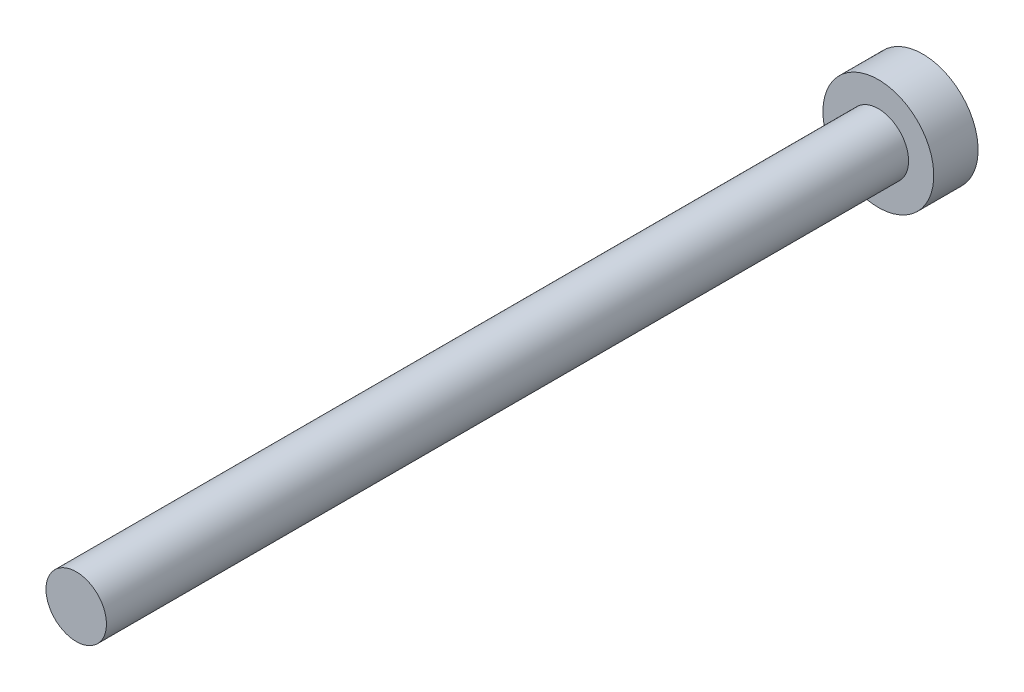
ISO-10303-21;
HEADER;
FILE_DESCRIPTION(('STEP AP214'),'2;1');
FILE_NAME('part.step','',(''),(''),'','','');
FILE_SCHEMA(('AUTOMOTIVE_DESIGN { 1 0 10303 214 1 1 1 1 }'));
ENDSEC;
DATA;
#1=APPLICATION_CONTEXT('core data for automotive mechanical design processes');
#2=APPLICATION_PROTOCOL_DEFINITION('international standard','automotive_design',2000,#1);
#3=PRODUCT_CONTEXT('',#1,'mechanical');
#4=PRODUCT('Part','Part','',(#3));
#5=PRODUCT_RELATED_PRODUCT_CATEGORY('part','',(#4));
#6=PRODUCT_DEFINITION_FORMATION('','',#4);
#7=PRODUCT_DEFINITION_CONTEXT('part definition',#1,'design');
#8=PRODUCT_DEFINITION('design','',#6,#7);
#9=PRODUCT_DEFINITION_SHAPE('','',#8);
#10=(LENGTH_UNIT() NAMED_UNIT(*) SI_UNIT(.MILLI.,.METRE.));
#11=(NAMED_UNIT(*) PLANE_ANGLE_UNIT() SI_UNIT($,.RADIAN.));
#12=(NAMED_UNIT(*) SI_UNIT($,.STERADIAN.) SOLID_ANGLE_UNIT());
#13=UNCERTAINTY_MEASURE_WITH_UNIT(LENGTH_MEASURE(1.E-05),#10,'distance_accuracy_value','');
#14=(GEOMETRIC_REPRESENTATION_CONTEXT(3) GLOBAL_UNCERTAINTY_ASSIGNED_CONTEXT((#13)) GLOBAL_UNIT_ASSIGNED_CONTEXT((#10,
#11,#12)) REPRESENTATION_CONTEXT('',''));
#15=CARTESIAN_POINT('',(0.,0.,0.));
#16=DIRECTION('',(0.,0.,1.));
#17=DIRECTION('',(1.,0.,0.));
#18=AXIS2_PLACEMENT_3D('',#15,#16,#17);
#19=CARTESIAN_POINT('',(0.,0.,94.5));
#20=DIRECTION('',(0.,0.,-1.));
#21=DIRECTION('',(-1.,0.,0.));
#22=AXIS2_PLACEMENT_3D('',#19,#20,#21);
#23=CYLINDRICAL_SURFACE('',#22,3.375);
#24=CARTESIAN_POINT('',(0.,0.,94.5));
#25=DIRECTION('',(0.,0.,1.));
#26=DIRECTION('',(1.,0.,0.));
#27=AXIS2_PLACEMENT_3D('',#24,#25,#26);
#28=CIRCLE('',#27,3.375);
#29=CARTESIAN_POINT('',(-3.375,0.,94.5));
#30=VERTEX_POINT('',#29);
#31=EDGE_CURVE('E53',#30,#30,#28,.T.);
#32=CARTESIAN_POINT('',(0.,0.,4.95));
#33=DIRECTION('',(0.,0.,-1.));
#34=DIRECTION('',(-1.,0.,0.));
#35=AXIS2_PLACEMENT_3D('',#32,#33,#34);
#36=CIRCLE('',#35,3.375);
#37=CARTESIAN_POINT('',(-3.375,0.,4.95));
#38=VERTEX_POINT('',#37);
#39=EDGE_CURVE('E10',#38,#38,#36,.T.);
#40=CARTESIAN_POINT('',(-3.375,0.,94.5));
#41=CARTESIAN_POINT('',(-3.375,0.,93.5671875));
#42=CARTESIAN_POINT('',(-3.375,0.,92.634375));
#43=CARTESIAN_POINT('',(-3.375,0.,90.76875));
#44=CARTESIAN_POINT('',(-3.375,0.,89.8359375));
#45=CARTESIAN_POINT('',(-3.375,0.,87.9703125));
#46=CARTESIAN_POINT('',(-3.375,0.,87.0375));
#47=CARTESIAN_POINT('',(-3.375,0.,85.171875));
#48=CARTESIAN_POINT('',(-3.375,0.,84.2390625));
#49=CARTESIAN_POINT('',(-3.375,0.,82.3734375));
#50=CARTESIAN_POINT('',(-3.375,0.,81.440625));
#51=CARTESIAN_POINT('',(-3.375,0.,79.575));
#52=CARTESIAN_POINT('',(-3.375,0.,78.6421875));
#53=CARTESIAN_POINT('',(-3.375,0.,76.7765625));
#54=CARTESIAN_POINT('',(-3.375,0.,75.84375));
#55=CARTESIAN_POINT('',(-3.375,0.,73.978125));
#56=CARTESIAN_POINT('',(-3.375,0.,73.0453125));
#57=CARTESIAN_POINT('',(-3.375,0.,71.1796875));
#58=CARTESIAN_POINT('',(-3.375,0.,70.246875));
#59=CARTESIAN_POINT('',(-3.375,0.,68.38125));
#60=CARTESIAN_POINT('',(-3.375,0.,67.4484375));
#61=CARTESIAN_POINT('',(-3.375,0.,65.5828125));
#62=CARTESIAN_POINT('',(-3.375,0.,64.65));
#63=CARTESIAN_POINT('',(-3.375,0.,62.784375));
#64=CARTESIAN_POINT('',(-3.375,0.,61.8515625));
#65=CARTESIAN_POINT('',(-3.375,0.,59.9859375));
#66=CARTESIAN_POINT('',(-3.375,0.,59.053125));
#67=CARTESIAN_POINT('',(-3.375,0.,57.1875));
#68=CARTESIAN_POINT('',(-3.375,0.,56.2546875));
#69=CARTESIAN_POINT('',(-3.375,0.,54.3890625));
#70=CARTESIAN_POINT('',(-3.375,0.,53.45625));
#71=CARTESIAN_POINT('',(-3.375,0.,51.590625));
#72=CARTESIAN_POINT('',(-3.375,0.,50.6578125));
#73=CARTESIAN_POINT('',(-3.375,0.,48.7921875));
#74=CARTESIAN_POINT('',(-3.375,0.,47.859375));
#75=CARTESIAN_POINT('',(-3.375,0.,45.99375));
#76=CARTESIAN_POINT('',(-3.375,0.,45.0609375));
#77=CARTESIAN_POINT('',(-3.375,0.,43.1953125));
#78=CARTESIAN_POINT('',(-3.375,0.,42.2625));
#79=CARTESIAN_POINT('',(-3.375,0.,40.396875));
#80=CARTESIAN_POINT('',(-3.375,0.,39.4640625));
#81=CARTESIAN_POINT('',(-3.375,0.,37.5984375));
#82=CARTESIAN_POINT('',(-3.375,0.,36.665625));
#83=CARTESIAN_POINT('',(-3.375,0.,34.8));
#84=CARTESIAN_POINT('',(-3.375,0.,33.8671875));
#85=CARTESIAN_POINT('',(-3.375,0.,32.0015625));
#86=CARTESIAN_POINT('',(-3.375,0.,31.06875));
#87=CARTESIAN_POINT('',(-3.375,0.,29.203125));
#88=CARTESIAN_POINT('',(-3.375,0.,28.2703125));
#89=CARTESIAN_POINT('',(-3.375,0.,26.4046875));
#90=CARTESIAN_POINT('',(-3.375,0.,25.471875));
#91=CARTESIAN_POINT('',(-3.375,0.,23.60625));
#92=CARTESIAN_POINT('',(-3.375,0.,22.6734375));
#93=CARTESIAN_POINT('',(-3.375,0.,20.8078125));
#94=CARTESIAN_POINT('',(-3.375,0.,19.875));
#95=CARTESIAN_POINT('',(-3.375,0.,18.009375));
#96=CARTESIAN_POINT('',(-3.375,0.,17.0765625));
#97=CARTESIAN_POINT('',(-3.375,0.,15.2109375));
#98=CARTESIAN_POINT('',(-3.375,0.,14.278125));
#99=CARTESIAN_POINT('',(-3.375,0.,12.4125));
#100=CARTESIAN_POINT('',(-3.375,0.,11.4796875));
#101=CARTESIAN_POINT('',(-3.375,0.,9.6140625));
#102=CARTESIAN_POINT('',(-3.375,0.,8.68125));
#103=CARTESIAN_POINT('',(-3.375,0.,6.815625));
#104=CARTESIAN_POINT('',(-3.375,0.,5.8828125));
#105=CARTESIAN_POINT('',(-3.375,0.,4.95));
#106=B_SPLINE_CURVE_WITH_KNOTS('',3,(#40,#41,#42,#43,#44,#45,#46,#47,#48,#49,#50,#51,#52,#53,
#54,#55,#56,#57,#58,#59,#60,#61,#62,#63,#64,#65,#66,#67,#68,#69,#70,#71,#72,#73,#74,#75,#76,#77,
#78,#79,#80,#81,#82,#83,#84,#85,#86,#87,#88,#89,#90,#91,#92,#93,#94,#95,#96,#97,#98,#99,#100,
#101,#102,#103,#104,#105),.UNSPECIFIED.,.F.,.F.,(4,2,2,2,2,2,2,2,2,2,2,2,2,2,2,2,2,2,2,2,2,2,2,
2,2,2,2,2,2,2,2,2,4),(0.,2.79843749999999,5.59687499999999,8.39531249999999,11.19375,13.9921875,
16.790625,19.5890625,22.3875,25.1859375,27.984375,30.7828125,33.58125,36.3796875,39.178125,
41.9765625,44.775,47.5734375,50.371875,53.1703125,55.96875,58.7671875,61.565625,64.3640625,
67.1625,69.9609375,72.759375,75.5578125,78.35625,81.1546875,83.953125,86.7515625,89.55),.UNSPECIFIED.);
#107=EDGE_CURVE('BSEAM46',#30,#38,#106,.T.);
#108=ORIENTED_EDGE('',*,*,#31,.F.);
#109=ORIENTED_EDGE('',*,*,#39,.F.);
#110=ORIENTED_EDGE('',*,*,#107,.T.);
#111=ORIENTED_EDGE('',*,*,#107,.F.);
#112=EDGE_LOOP('',(#108,#110,#109,#111));
#113=FACE_BOUND('',#112,.T.);
#114=ADVANCED_FACE('F46',(#113),#23,.T.);
#115=CARTESIAN_POINT('',(0.,0.,94.5));
#116=DIRECTION('',(0.,0.,1.));
#117=DIRECTION('',(1.,0.,0.));
#118=AXIS2_PLACEMENT_3D('',#115,#116,#117);
#119=PLANE('',#118);
#120=ORIENTED_EDGE('',*,*,#31,.T.);
#121=EDGE_LOOP('',(#120));
#122=FACE_BOUND('',#121,.T.);
#123=ADVANCED_FACE('F75',(#122),#119,.T.);
#124=CARTESIAN_POINT('',(0.,0.,4.95));
#125=DIRECTION('',(0.,0.,-1.));
#126=DIRECTION('',(-1.,0.,0.));
#127=AXIS2_PLACEMENT_3D('',#124,#125,#126);
#128=CYLINDRICAL_SURFACE('',#127,6.1875);
#129=CARTESIAN_POINT('',(0.,0.,4.95));
#130=DIRECTION('',(0.,0.,-1.));
#131=DIRECTION('',(-1.,0.,0.));
#132=AXIS2_PLACEMENT_3D('',#129,#130,#131);
#133=CIRCLE('',#132,6.1875);
#134=CARTESIAN_POINT('',(-6.1875,0.,4.95));
#135=VERTEX_POINT('',#134);
#136=EDGE_CURVE('E58',#135,#135,#133,.T.);
#137=ORIENTED_EDGE('',*,*,#136,.T.);
#138=EDGE_LOOP('',(#137));
#139=FACE_BOUND('',#138,.T.);
#140=CARTESIAN_POINT('',(0.,0.,0.));
#141=DIRECTION('',(0.,0.,-1.));
#142=DIRECTION('',(-1.,0.,0.));
#143=AXIS2_PLACEMENT_3D('',#140,#141,#142);
#144=CIRCLE('',#143,6.1875);
#145=CARTESIAN_POINT('',(-6.1875,0.,0.));
#146=VERTEX_POINT('',#145);
#147=EDGE_CURVE('E63',#146,#146,#144,.T.);
#148=ORIENTED_EDGE('',*,*,#147,.F.);
#149=EDGE_LOOP('',(#148));
#150=FACE_BOUND('',#149,.T.);
#151=ADVANCED_FACE('F72',(#139,#150),#128,.T.);
#152=CARTESIAN_POINT('',(0.,0.,4.95));
#153=DIRECTION('',(0.,0.,-1.));
#154=DIRECTION('',(-1.,0.,0.));
#155=AXIS2_PLACEMENT_3D('',#152,#153,#154);
#156=PLANE('',#155);
#157=ORIENTED_EDGE('',*,*,#39,.T.);
#158=EDGE_LOOP('',(#157));
#159=FACE_BOUND('',#158,.T.);
#160=ORIENTED_EDGE('',*,*,#136,.F.);
#161=EDGE_LOOP('',(#160));
#162=FACE_BOUND('',#161,.T.);
#163=ADVANCED_FACE('F74',(#159,#162),#156,.F.);
#164=CARTESIAN_POINT('',(0.,0.,0.));
#165=DIRECTION('',(0.,0.,1.));
#166=DIRECTION('',(1.,0.,0.));
#167=AXIS2_PLACEMENT_3D('',#164,#165,#166);
#168=PLANE('',#167);
#169=ORIENTED_EDGE('',*,*,#147,.T.);
#170=EDGE_LOOP('',(#169));
#171=FACE_BOUND('',#170,.T.);
#172=ADVANCED_FACE('F70',(#171),#168,.F.);
#173=CLOSED_SHELL('',(#114,#123,#151,#163,#172));
#174=MANIFOLD_SOLID_BREP('B2',#173);
#175=ADVANCED_BREP_SHAPE_REPRESENTATION('',(#18,#174),#14);
#176=SHAPE_DEFINITION_REPRESENTATION(#9,#175);
ENDSEC;
END-ISO-10303-21;
